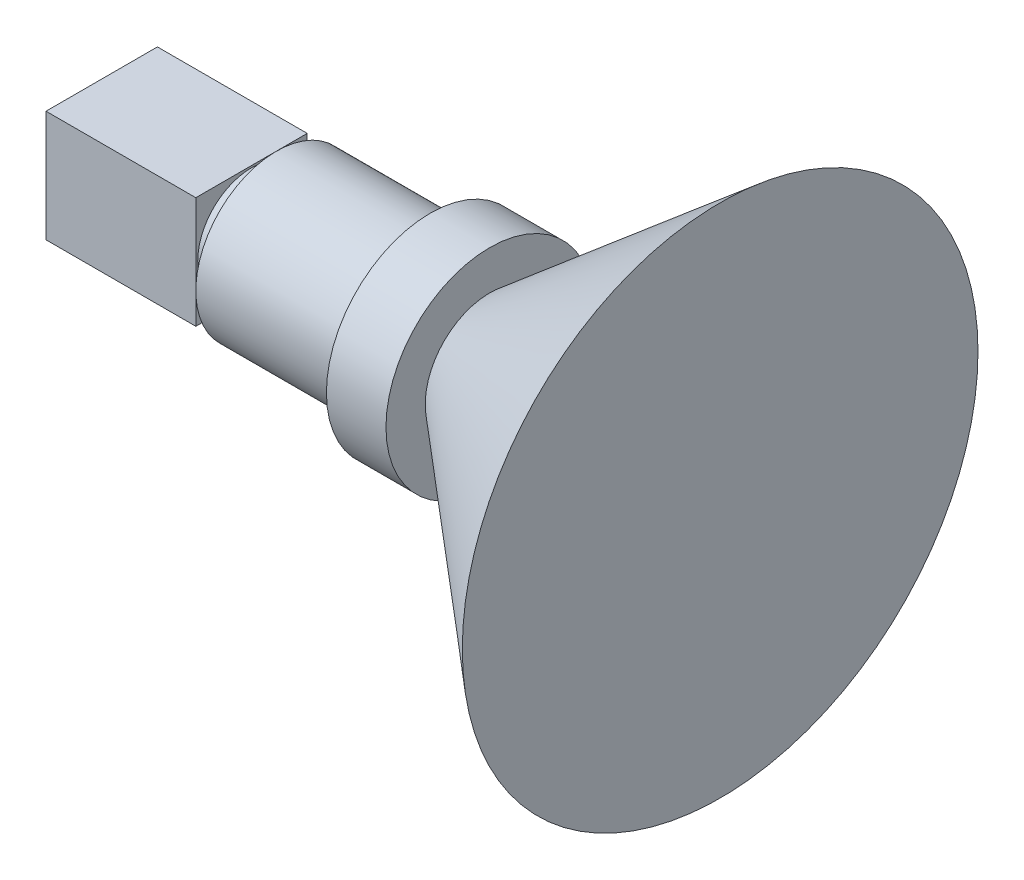
ISO-10303-21;
HEADER;
FILE_DESCRIPTION(('STEP AP214'),'2;1');
FILE_NAME('part.step','',(''),(''),'','','');
FILE_SCHEMA(('AUTOMOTIVE_DESIGN { 1 0 10303 214 1 1 1 1 }'));
ENDSEC;
DATA;
#1=APPLICATION_CONTEXT('core data for automotive mechanical design processes');
#2=APPLICATION_PROTOCOL_DEFINITION('international standard','automotive_design',2000,#1);
#3=PRODUCT_CONTEXT('',#1,'mechanical');
#4=PRODUCT('Part','Part','',(#3));
#5=PRODUCT_RELATED_PRODUCT_CATEGORY('part','',(#4));
#6=PRODUCT_DEFINITION_FORMATION('','',#4);
#7=PRODUCT_DEFINITION_CONTEXT('part definition',#1,'design');
#8=PRODUCT_DEFINITION('design','',#6,#7);
#9=PRODUCT_DEFINITION_SHAPE('','',#8);
#10=(LENGTH_UNIT() NAMED_UNIT(*) SI_UNIT(.MILLI.,.METRE.));
#11=(NAMED_UNIT(*) PLANE_ANGLE_UNIT() SI_UNIT($,.RADIAN.));
#12=(NAMED_UNIT(*) SI_UNIT($,.STERADIAN.) SOLID_ANGLE_UNIT());
#13=UNCERTAINTY_MEASURE_WITH_UNIT(LENGTH_MEASURE(1.E-05),#10,'distance_accuracy_value','');
#14=(GEOMETRIC_REPRESENTATION_CONTEXT(3) GLOBAL_UNCERTAINTY_ASSIGNED_CONTEXT((#13)) GLOBAL_UNIT_ASSIGNED_CONTEXT((#10,
#11,#12)) REPRESENTATION_CONTEXT('',''));
#15=CARTESIAN_POINT('',(0.,0.,0.));
#16=DIRECTION('',(0.,0.,1.));
#17=DIRECTION('',(1.,0.,0.));
#18=AXIS2_PLACEMENT_3D('',#15,#16,#17);
#19=CARTESIAN_POINT('',(19.5,14.5,14.5));
#20=DIRECTION('',(-1.,0.,0.));
#21=DIRECTION('',(0.,0.,1.));
#22=AXIS2_PLACEMENT_3D('',#19,#20,#21);
#23=PLANE('',#22);
#24=CARTESIAN_POINT('',(19.5,0.,0.));
#25=DIRECTION('',(1.,0.,0.));
#26=DIRECTION('',(0.,0.,-1.));
#27=AXIS2_PLACEMENT_3D('',#24,#25,#26);
#28=CIRCLE('',#27,14.);
#29=CARTESIAN_POINT('',(19.5,0.,14.));
#30=VERTEX_POINT('',#29);
#31=EDGE_CURVE('E11',#30,#30,#28,.T.);
#32=ORIENTED_EDGE('',*,*,#31,.F.);
#33=EDGE_LOOP('',(#32));
#34=FACE_BOUND('',#33,.T.);
#35=DIRECTION('',(0.,0.,-1.));
#36=VECTOR('',#35,1.);
#37=CARTESIAN_POINT('',(19.5,-14.5,14.5));
#38=LINE('',#37,#36);
#39=CARTESIAN_POINT('',(19.5,-14.5,14.5));
#40=VERTEX_POINT('',#39);
#41=CARTESIAN_POINT('',(19.5,-14.5,-14.5));
#42=VERTEX_POINT('',#41);
#43=EDGE_CURVE('E158',#40,#42,#38,.T.);
#44=ORIENTED_EDGE('',*,*,#43,.T.);
#45=DIRECTION('',(0.,-1.,0.));
#46=VECTOR('',#45,1.);
#47=CARTESIAN_POINT('',(19.5,14.5,-14.5));
#48=LINE('',#47,#46);
#49=CARTESIAN_POINT('',(19.5,14.5,-14.5));
#50=VERTEX_POINT('',#49);
#51=EDGE_CURVE('E56',#50,#42,#48,.T.);
#52=ORIENTED_EDGE('',*,*,#51,.F.);
#53=DIRECTION('',(0.,0.,-1.));
#54=VECTOR('',#53,1.);
#55=CARTESIAN_POINT('',(19.5,14.5,14.5));
#56=LINE('',#55,#54);
#57=CARTESIAN_POINT('',(19.5,14.5,14.5));
#58=VERTEX_POINT('',#57);
#59=EDGE_CURVE('E160',#58,#50,#56,.T.);
#60=ORIENTED_EDGE('',*,*,#59,.F.);
#61=DIRECTION('',(0.,-1.,0.));
#62=VECTOR('',#61,1.);
#63=CARTESIAN_POINT('',(19.5,14.5,14.5));
#64=LINE('',#63,#62);
#65=EDGE_CURVE('E166',#58,#40,#64,.T.);
#66=ORIENTED_EDGE('',*,*,#65,.T.);
#67=EDGE_LOOP('',(#44,#52,#60,#66));
#68=FACE_BOUND('',#67,.T.);
#69=ADVANCED_FACE('F47',(#34,#68),#23,.F.);
#70=CARTESIAN_POINT('',(-19.5,14.5,-14.5));
#71=DIRECTION('',(0.,0.,1.));
#72=DIRECTION('',(1.,0.,0.));
#73=AXIS2_PLACEMENT_3D('',#70,#71,#72);
#74=PLANE('',#73);
#75=DIRECTION('',(-1.,0.,0.));
#76=VECTOR('',#75,1.);
#77=CARTESIAN_POINT('',(-19.5,-14.5,-14.5));
#78=LINE('',#77,#76);
#79=CARTESIAN_POINT('',(-19.5,-14.5,-14.5));
#80=VERTEX_POINT('',#79);
#81=EDGE_CURVE('E169',#42,#80,#78,.T.);
#82=ORIENTED_EDGE('',*,*,#81,.T.);
#83=DIRECTION('',(0.,-1.,0.));
#84=VECTOR('',#83,1.);
#85=CARTESIAN_POINT('',(-19.5,14.5,-14.5));
#86=LINE('',#85,#84);
#87=CARTESIAN_POINT('',(-19.5,14.5,-14.5));
#88=VERTEX_POINT('',#87);
#89=EDGE_CURVE('E176',#88,#80,#86,.T.);
#90=ORIENTED_EDGE('',*,*,#89,.F.);
#91=DIRECTION('',(-1.,0.,0.));
#92=VECTOR('',#91,1.);
#93=CARTESIAN_POINT('',(-19.5,14.5,-14.5));
#94=LINE('',#93,#92);
#95=EDGE_CURVE('E97',#50,#88,#94,.T.);
#96=ORIENTED_EDGE('',*,*,#95,.F.);
#97=ORIENTED_EDGE('',*,*,#51,.T.);
#98=EDGE_LOOP('',(#82,#90,#96,#97));
#99=FACE_BOUND('',#98,.T.);
#100=ADVANCED_FACE('F178',(#99),#74,.F.);
#101=CARTESIAN_POINT('',(-19.5,14.5,14.5));
#102=DIRECTION('',(1.,0.,0.));
#103=DIRECTION('',(0.,0.,-1.));
#104=AXIS2_PLACEMENT_3D('',#101,#102,#103);
#105=PLANE('',#104);
#106=DIRECTION('',(0.,0.,1.));
#107=VECTOR('',#106,1.);
#108=CARTESIAN_POINT('',(-19.5,-14.5,14.5));
#109=LINE('',#108,#107);
#110=CARTESIAN_POINT('',(-19.5,-14.5,14.5));
#111=VERTEX_POINT('',#110);
#112=EDGE_CURVE('E83',#80,#111,#109,.T.);
#113=ORIENTED_EDGE('',*,*,#112,.T.);
#114=DIRECTION('',(0.,-1.,0.));
#115=VECTOR('',#114,1.);
#116=CARTESIAN_POINT('',(-19.5,14.5,14.5));
#117=LINE('',#116,#115);
#118=CARTESIAN_POINT('',(-19.5,14.5,14.5));
#119=VERTEX_POINT('',#118);
#120=EDGE_CURVE('E174',#119,#111,#117,.T.);
#121=ORIENTED_EDGE('',*,*,#120,.F.);
#122=DIRECTION('',(0.,0.,1.));
#123=VECTOR('',#122,1.);
#124=CARTESIAN_POINT('',(-19.5,14.5,14.5));
#125=LINE('',#124,#123);
#126=EDGE_CURVE('E163',#88,#119,#125,.T.);
#127=ORIENTED_EDGE('',*,*,#126,.F.);
#128=ORIENTED_EDGE('',*,*,#89,.T.);
#129=EDGE_LOOP('',(#113,#121,#127,#128));
#130=FACE_BOUND('',#129,.T.);
#131=ADVANCED_FACE('F207',(#130),#105,.F.);
#132=CARTESIAN_POINT('',(-19.5,14.5,14.5));
#133=DIRECTION('',(0.,0.,-1.));
#134=DIRECTION('',(-1.,0.,0.));
#135=AXIS2_PLACEMENT_3D('',#132,#133,#134);
#136=PLANE('',#135);
#137=DIRECTION('',(1.,0.,0.));
#138=VECTOR('',#137,1.);
#139=CARTESIAN_POINT('',(-19.5,-14.5,14.5));
#140=LINE('',#139,#138);
#141=EDGE_CURVE('E89',#111,#40,#140,.T.);
#142=ORIENTED_EDGE('',*,*,#141,.T.);
#143=ORIENTED_EDGE('',*,*,#65,.F.);
#144=DIRECTION('',(1.,0.,0.));
#145=VECTOR('',#144,1.);
#146=CARTESIAN_POINT('',(-19.5,14.5,14.5));
#147=LINE('',#146,#145);
#148=EDGE_CURVE('E65',#119,#58,#147,.T.);
#149=ORIENTED_EDGE('',*,*,#148,.F.);
#150=ORIENTED_EDGE('',*,*,#120,.T.);
#151=EDGE_LOOP('',(#142,#143,#149,#150));
#152=FACE_BOUND('',#151,.T.);
#153=ADVANCED_FACE('F197',(#152),#136,.F.);
#154=CARTESIAN_POINT('',(0.,14.5,0.));
#155=DIRECTION('',(0.,-1.,0.));
#156=DIRECTION('',(0.,0.,-1.));
#157=AXIS2_PLACEMENT_3D('',#154,#155,#156);
#158=PLANE('',#157);
#159=ORIENTED_EDGE('',*,*,#59,.T.);
#160=ORIENTED_EDGE('',*,*,#95,.T.);
#161=ORIENTED_EDGE('',*,*,#126,.T.);
#162=ORIENTED_EDGE('',*,*,#148,.T.);
#163=EDGE_LOOP('',(#159,#160,#161,#162));
#164=FACE_BOUND('',#163,.T.);
#165=ADVANCED_FACE('F186',(#164),#158,.F.);
#166=CARTESIAN_POINT('',(0.,-14.5,0.));
#167=DIRECTION('',(0.,-1.,0.));
#168=DIRECTION('',(0.,0.,-1.));
#169=AXIS2_PLACEMENT_3D('',#166,#167,#168);
#170=PLANE('',#169);
#171=CARTESIAN_POINT('',(16.5,-14.5,-11.5));
#172=DIRECTION('',(0.,-1.,0.));
#173=DIRECTION('',(0.,0.,-1.));
#174=AXIS2_PLACEMENT_3D('',#171,#172,#173);
#175=CIRCLE('',#174,1.24999999999999);
#176=CARTESIAN_POINT('',(16.5,-14.5,-12.75));
#177=VERTEX_POINT('',#176);
#178=EDGE_CURVE('E121',#177,#177,#175,.T.);
#179=ORIENTED_EDGE('',*,*,#178,.F.);
#180=EDGE_LOOP('',(#179));
#181=FACE_BOUND('',#180,.T.);
#182=CARTESIAN_POINT('',(-16.5,-14.5,-11.5));
#183=DIRECTION('',(0.,-1.,0.));
#184=DIRECTION('',(0.,0.,-1.));
#185=AXIS2_PLACEMENT_3D('',#182,#183,#184);
#186=CIRCLE('',#185,1.24999999999999);
#187=CARTESIAN_POINT('',(-16.5,-14.5,-12.75));
#188=VERTEX_POINT('',#187);
#189=EDGE_CURVE('E120',#188,#188,#186,.T.);
#190=ORIENTED_EDGE('',*,*,#189,.F.);
#191=EDGE_LOOP('',(#190));
#192=FACE_BOUND('',#191,.T.);
#193=CARTESIAN_POINT('',(-16.5,-14.5,11.5));
#194=DIRECTION('',(0.,-1.,0.));
#195=DIRECTION('',(0.,0.,-1.));
#196=AXIS2_PLACEMENT_3D('',#193,#194,#195);
#197=CIRCLE('',#196,1.24999999999999);
#198=CARTESIAN_POINT('',(-16.5,-14.5,10.25));
#199=VERTEX_POINT('',#198);
#200=EDGE_CURVE('E132',#199,#199,#197,.T.);
#201=ORIENTED_EDGE('',*,*,#200,.F.);
#202=EDGE_LOOP('',(#201));
#203=FACE_BOUND('',#202,.T.);
#204=CARTESIAN_POINT('',(16.5,-14.5,11.5));
#205=DIRECTION('',(0.,-1.,0.));
#206=DIRECTION('',(0.,0.,-1.));
#207=AXIS2_PLACEMENT_3D('',#204,#205,#206);
#208=CIRCLE('',#207,1.24999999999999);
#209=CARTESIAN_POINT('',(16.5,-14.5,10.25));
#210=VERTEX_POINT('',#209);
#211=EDGE_CURVE('E138',#210,#210,#208,.T.);
#212=ORIENTED_EDGE('',*,*,#211,.F.);
#213=EDGE_LOOP('',(#212));
#214=FACE_BOUND('',#213,.T.);
#215=ORIENTED_EDGE('',*,*,#43,.F.);
#216=ORIENTED_EDGE('',*,*,#141,.F.);
#217=ORIENTED_EDGE('',*,*,#112,.F.);
#218=ORIENTED_EDGE('',*,*,#81,.F.);
#219=EDGE_LOOP('',(#215,#216,#217,#218));
#220=FACE_BOUND('',#219,.T.);
#221=ADVANCED_FACE('F183',(#181,#192,#203,#214,#220),#170,.T.);
#222=CARTESIAN_POINT('',(26.,0.,0.));
#223=DIRECTION('',(-1.,0.,0.));
#224=DIRECTION('',(0.,0.,1.));
#225=AXIS2_PLACEMENT_3D('',#222,#223,#224);
#226=CYLINDRICAL_SURFACE('',#225,14.);
#227=CARTESIAN_POINT('',(26.,0.,0.));
#228=DIRECTION('',(1.,0.,0.));
#229=DIRECTION('',(0.,0.,-1.));
#230=AXIS2_PLACEMENT_3D('',#227,#228,#229);
#231=CIRCLE('',#230,14.);
#232=CARTESIAN_POINT('',(26.,0.,14.));
#233=VERTEX_POINT('',#232);
#234=EDGE_CURVE('E154',#233,#233,#231,.T.);
#235=CARTESIAN_POINT('',(26.,0.,14.));
#236=CARTESIAN_POINT('',(25.9322916666667,0.,14.));
#237=CARTESIAN_POINT('',(25.8645833333333,0.,14.));
#238=CARTESIAN_POINT('',(25.7291666666667,0.,14.));
#239=CARTESIAN_POINT('',(25.6614583333333,0.,14.));
#240=CARTESIAN_POINT('',(25.5260416666667,0.,14.));
#241=CARTESIAN_POINT('',(25.4583333333333,0.,14.));
#242=CARTESIAN_POINT('',(25.3229166666667,0.,14.));
#243=CARTESIAN_POINT('',(25.2552083333333,0.,14.));
#244=CARTESIAN_POINT('',(25.1197916666667,0.,14.));
#245=CARTESIAN_POINT('',(25.0520833333333,0.,14.));
#246=CARTESIAN_POINT('',(24.9166666666667,0.,14.));
#247=CARTESIAN_POINT('',(24.8489583333333,0.,14.));
#248=CARTESIAN_POINT('',(24.7135416666667,0.,14.));
#249=CARTESIAN_POINT('',(24.6458333333333,0.,14.));
#250=CARTESIAN_POINT('',(24.5104166666667,0.,14.));
#251=CARTESIAN_POINT('',(24.4427083333333,0.,14.));
#252=CARTESIAN_POINT('',(24.3072916666667,0.,14.));
#253=CARTESIAN_POINT('',(24.2395833333333,0.,14.));
#254=CARTESIAN_POINT('',(24.1041666666667,0.,14.));
#255=CARTESIAN_POINT('',(24.0364583333333,0.,14.));
#256=CARTESIAN_POINT('',(23.9010416666667,0.,14.));
#257=CARTESIAN_POINT('',(23.8333333333333,0.,14.));
#258=CARTESIAN_POINT('',(23.6979166666667,0.,14.));
#259=CARTESIAN_POINT('',(23.6302083333333,0.,14.));
#260=CARTESIAN_POINT('',(23.4947916666667,0.,14.));
#261=CARTESIAN_POINT('',(23.4270833333333,0.,14.));
#262=CARTESIAN_POINT('',(23.2916666666667,0.,14.));
#263=CARTESIAN_POINT('',(23.2239583333333,0.,14.));
#264=CARTESIAN_POINT('',(23.0885416666667,0.,14.));
#265=CARTESIAN_POINT('',(23.0208333333333,0.,14.));
#266=CARTESIAN_POINT('',(22.8854166666667,0.,14.));
#267=CARTESIAN_POINT('',(22.8177083333333,0.,14.));
#268=CARTESIAN_POINT('',(22.6822916666667,0.,14.));
#269=CARTESIAN_POINT('',(22.6145833333333,0.,14.));
#270=CARTESIAN_POINT('',(22.4791666666667,0.,14.));
#271=CARTESIAN_POINT('',(22.4114583333333,0.,14.));
#272=CARTESIAN_POINT('',(22.2760416666667,0.,14.));
#273=CARTESIAN_POINT('',(22.2083333333333,0.,14.));
#274=CARTESIAN_POINT('',(22.0729166666667,0.,14.));
#275=CARTESIAN_POINT('',(22.0052083333333,0.,14.));
#276=CARTESIAN_POINT('',(21.8697916666667,0.,14.));
#277=CARTESIAN_POINT('',(21.8020833333333,0.,14.));
#278=CARTESIAN_POINT('',(21.6666666666667,0.,14.));
#279=CARTESIAN_POINT('',(21.5989583333333,0.,14.));
#280=CARTESIAN_POINT('',(21.4635416666667,0.,14.));
#281=CARTESIAN_POINT('',(21.3958333333333,0.,14.));
#282=CARTESIAN_POINT('',(21.2604166666667,0.,14.));
#283=CARTESIAN_POINT('',(21.1927083333333,0.,14.));
#284=CARTESIAN_POINT('',(21.0572916666667,0.,14.));
#285=CARTESIAN_POINT('',(20.9895833333333,0.,14.));
#286=CARTESIAN_POINT('',(20.8541666666667,0.,14.));
#287=CARTESIAN_POINT('',(20.7864583333333,0.,14.));
#288=CARTESIAN_POINT('',(20.6510416666667,0.,14.));
#289=CARTESIAN_POINT('',(20.5833333333333,0.,14.));
#290=CARTESIAN_POINT('',(20.4479166666667,0.,14.));
#291=CARTESIAN_POINT('',(20.3802083333333,0.,14.));
#292=CARTESIAN_POINT('',(20.2447916666667,0.,14.));
#293=CARTESIAN_POINT('',(20.1770833333333,0.,14.));
#294=CARTESIAN_POINT('',(20.0416666666667,0.,14.));
#295=CARTESIAN_POINT('',(19.9739583333333,0.,14.));
#296=CARTESIAN_POINT('',(19.8385416666667,0.,14.));
#297=CARTESIAN_POINT('',(19.7708333333333,0.,14.));
#298=CARTESIAN_POINT('',(19.6354166666667,0.,14.));
#299=CARTESIAN_POINT('',(19.5677083333333,0.,14.));
#300=CARTESIAN_POINT('',(19.5,0.,14.));
#301=B_SPLINE_CURVE_WITH_KNOTS('',3,(#235,#236,#237,#238,#239,#240,#241,#242,#243,#244,#245,
#246,#247,#248,#249,#250,#251,#252,#253,#254,#255,#256,#257,#258,#259,#260,#261,#262,#263,#264,
#265,#266,#267,#268,#269,#270,#271,#272,#273,#274,#275,#276,#277,#278,#279,#280,#281,#282,#283,
#284,#285,#286,#287,#288,#289,#290,#291,#292,#293,#294,#295,#296,#297,#298,#299,#300),
.UNSPECIFIED.,.F.,.F.,(4,2,2,2,2,2,2,2,2,2,2,2,2,2,2,2,2,2,2,2,2,2,2,2,2,2,2,2,2,2,2,2,4),(0.,
0.203125000000002,0.40625,0.609375000000002,0.812500000000001,1.015625,1.21875,1.421875,1.625,
1.828125,2.03125,2.234375,2.4375,2.640625,2.84375,3.046875,3.25,3.453125,3.65625,3.859375,
4.0625,4.265625,4.46875,4.671875,4.875,5.078125,5.28125,5.484375,5.6875,5.890625,6.09375,
6.296875,6.5),.UNSPECIFIED.);
#302=EDGE_CURVE('BSEAM185',#233,#30,#301,.T.);
#303=ORIENTED_EDGE('',*,*,#234,.F.);
#304=ORIENTED_EDGE('',*,*,#31,.T.);
#305=ORIENTED_EDGE('',*,*,#302,.T.);
#306=ORIENTED_EDGE('',*,*,#302,.F.);
#307=EDGE_LOOP('',(#303,#305,#304,#306));
#308=FACE_BOUND('',#307,.T.);
#309=ADVANCED_FACE('F185',(#308),#226,.T.);
#310=CARTESIAN_POINT('',(66.,0.,0.));
#311=DIRECTION('',(-1.,0.,0.));
#312=DIRECTION('',(0.,0.,1.));
#313=AXIS2_PLACEMENT_3D('',#310,#311,#312);
#314=CYLINDRICAL_SURFACE('',#313,21.);
#315=CARTESIAN_POINT('',(66.,0.,0.));
#316=DIRECTION('',(1.,0.,0.));
#317=DIRECTION('',(0.,0.,-1.));
#318=AXIS2_PLACEMENT_3D('',#315,#316,#317);
#319=CIRCLE('',#318,21.);
#320=CARTESIAN_POINT('',(66.,0.,-21.));
#321=VERTEX_POINT('',#320);
#322=EDGE_CURVE('E151',#321,#321,#319,.T.);
#323=ORIENTED_EDGE('',*,*,#322,.F.);
#324=EDGE_LOOP('',(#323));
#325=FACE_BOUND('',#324,.T.);
#326=CARTESIAN_POINT('',(26.,0.,0.));
#327=DIRECTION('',(1.,0.,0.));
#328=DIRECTION('',(0.,0.,-1.));
#329=AXIS2_PLACEMENT_3D('',#326,#327,#328);
#330=CIRCLE('',#329,21.);
#331=CARTESIAN_POINT('',(26.,0.,-21.));
#332=VERTEX_POINT('',#331);
#333=EDGE_CURVE('E148',#332,#332,#330,.T.);
#334=ORIENTED_EDGE('',*,*,#333,.T.);
#335=EDGE_LOOP('',(#334));
#336=FACE_BOUND('',#335,.T.);
#337=ADVANCED_FACE('F193',(#325,#336),#314,.T.);
#338=CARTESIAN_POINT('',(26.,0.,0.));
#339=DIRECTION('',(1.,0.,0.));
#340=DIRECTION('',(0.,0.,-1.));
#341=AXIS2_PLACEMENT_3D('',#338,#339,#340);
#342=PLANE('',#341);
#343=ORIENTED_EDGE('',*,*,#234,.T.);
#344=EDGE_LOOP('',(#343));
#345=FACE_BOUND('',#344,.T.);
#346=ORIENTED_EDGE('',*,*,#333,.F.);
#347=EDGE_LOOP('',(#346));
#348=FACE_BOUND('',#347,.T.);
#349=ADVANCED_FACE('F250',(#345,#348),#342,.F.);
#350=CARTESIAN_POINT('',(81.5,0.,0.));
#351=DIRECTION('',(-1.,0.,0.));
#352=DIRECTION('',(0.,0.,1.));
#353=AXIS2_PLACEMENT_3D('',#350,#351,#352);
#354=CYLINDRICAL_SURFACE('',#353,27.);
#355=CARTESIAN_POINT('',(81.5,0.,0.));
#356=DIRECTION('',(1.,0.,0.));
#357=DIRECTION('',(0.,0.,-1.));
#358=AXIS2_PLACEMENT_3D('',#355,#356,#357);
#359=CIRCLE('',#358,27.);
#360=CARTESIAN_POINT('',(81.5,0.,-27.));
#361=VERTEX_POINT('',#360);
#362=EDGE_CURVE('E145',#361,#361,#359,.T.);
#363=ORIENTED_EDGE('',*,*,#362,.F.);
#364=EDGE_LOOP('',(#363));
#365=FACE_BOUND('',#364,.T.);
#366=CARTESIAN_POINT('',(66.,0.,0.));
#367=DIRECTION('',(1.,0.,0.));
#368=DIRECTION('',(0.,0.,-1.));
#369=AXIS2_PLACEMENT_3D('',#366,#367,#368);
#370=CIRCLE('',#369,27.);
#371=CARTESIAN_POINT('',(66.,0.,-27.));
#372=VERTEX_POINT('',#371);
#373=EDGE_CURVE('E144',#372,#372,#370,.T.);
#374=ORIENTED_EDGE('',*,*,#373,.T.);
#375=EDGE_LOOP('',(#374));
#376=FACE_BOUND('',#375,.T.);
#377=ADVANCED_FACE('F260',(#365,#376),#354,.T.);
#378=CARTESIAN_POINT('',(81.5,0.,0.));
#379=DIRECTION('',(1.,0.,0.));
#380=DIRECTION('',(0.,0.,-1.));
#381=AXIS2_PLACEMENT_3D('',#378,#379,#380);
#382=PLANE('',#381);
#383=CARTESIAN_POINT('',(81.5,0.,0.));
#384=DIRECTION('',(1.,0.,0.));
#385=DIRECTION('',(0.,0.,-1.));
#386=AXIS2_PLACEMENT_3D('',#383,#384,#385);
#387=CIRCLE('',#386,16.7819926235456);
#388=CARTESIAN_POINT('',(81.5,0.,-16.7819926235456));
#389=VERTEX_POINT('',#388);
#390=EDGE_CURVE('E50',#389,#389,#387,.F.);
#391=ORIENTED_EDGE('',*,*,#390,.T.);
#392=EDGE_LOOP('',(#391));
#393=FACE_BOUND('',#392,.T.);
#394=ORIENTED_EDGE('',*,*,#362,.T.);
#395=EDGE_LOOP('',(#394));
#396=FACE_BOUND('',#395,.T.);
#397=ADVANCED_FACE('F270',(#393,#396),#382,.T.);
#398=CARTESIAN_POINT('',(66.,0.,0.));
#399=DIRECTION('',(1.,0.,0.));
#400=DIRECTION('',(0.,0.,-1.));
#401=AXIS2_PLACEMENT_3D('',#398,#399,#400);
#402=PLANE('',#401);
#403=ORIENTED_EDGE('',*,*,#322,.T.);
#404=EDGE_LOOP('',(#403));
#405=FACE_BOUND('',#404,.T.);
#406=ORIENTED_EDGE('',*,*,#373,.F.);
#407=EDGE_LOOP('',(#406));
#408=FACE_BOUND('',#407,.T.);
#409=ADVANCED_FACE('F280',(#405,#408),#402,.F.);
#410=CARTESIAN_POINT('',(16.5,-9.5,11.5));
#411=DIRECTION('',(0.,-1.,0.));
#412=DIRECTION('',(0.,0.,-1.));
#413=AXIS2_PLACEMENT_3D('',#410,#411,#412);
#414=CONICAL_SURFACE('',#413,1.25,1.02974425867665);
#415=CARTESIAN_POINT('',(16.5,-8.74892422621555,11.5));
#416=VERTEX_POINT('',#415);
#417=VERTEX_LOOP('',#416);
#418=FACE_BOUND('',#417,.T.);
#419=CARTESIAN_POINT('',(16.5,-9.5,11.5));
#420=DIRECTION('',(0.,-1.,0.));
#421=DIRECTION('',(0.,0.,-1.));
#422=AXIS2_PLACEMENT_3D('',#419,#420,#421);
#423=CIRCLE('',#422,1.25);
#424=CARTESIAN_POINT('',(16.5,-9.5,10.25));
#425=VERTEX_POINT('',#424);
#426=EDGE_CURVE('E141',#425,#425,#423,.T.);
#427=ORIENTED_EDGE('',*,*,#426,.T.);
#428=EDGE_LOOP('',(#427));
#429=FACE_BOUND('',#428,.T.);
#430=ADVANCED_FACE('F291',(#418,#429),#414,.F.);
#431=CARTESIAN_POINT('',(16.5,-14.5,11.5));
#432=DIRECTION('',(0.,-1.,0.));
#433=DIRECTION('',(0.,0.,-1.));
#434=AXIS2_PLACEMENT_3D('',#431,#432,#433);
#435=CYLINDRICAL_SURFACE('',#434,1.24999999999999);
#436=ORIENTED_EDGE('',*,*,#426,.F.);
#437=EDGE_LOOP('',(#436));
#438=FACE_BOUND('',#437,.T.);
#439=ORIENTED_EDGE('',*,*,#211,.T.);
#440=EDGE_LOOP('',(#439));
#441=FACE_BOUND('',#440,.T.);
#442=ADVANCED_FACE('F300',(#438,#441),#435,.F.);
#443=CARTESIAN_POINT('',(-16.5,-9.5,11.5));
#444=DIRECTION('',(0.,-1.,0.));
#445=DIRECTION('',(0.,0.,-1.));
#446=AXIS2_PLACEMENT_3D('',#443,#444,#445);
#447=CONICAL_SURFACE('',#446,1.25,1.02974425867665);
#448=CARTESIAN_POINT('',(-16.5,-8.74892422621555,11.5));
#449=VERTEX_POINT('',#448);
#450=VERTEX_LOOP('',#449);
#451=FACE_BOUND('',#450,.T.);
#452=CARTESIAN_POINT('',(-16.5,-9.5,11.5));
#453=DIRECTION('',(0.,-1.,0.));
#454=DIRECTION('',(0.,0.,-1.));
#455=AXIS2_PLACEMENT_3D('',#452,#453,#454);
#456=CIRCLE('',#455,1.25);
#457=CARTESIAN_POINT('',(-16.5,-9.5,10.25));
#458=VERTEX_POINT('',#457);
#459=EDGE_CURVE('E135',#458,#458,#456,.T.);
#460=ORIENTED_EDGE('',*,*,#459,.T.);
#461=EDGE_LOOP('',(#460));
#462=FACE_BOUND('',#461,.T.);
#463=ADVANCED_FACE('F310',(#451,#462),#447,.F.);
#464=CARTESIAN_POINT('',(-16.5,-14.5,11.5));
#465=DIRECTION('',(0.,-1.,0.));
#466=DIRECTION('',(0.,0.,-1.));
#467=AXIS2_PLACEMENT_3D('',#464,#465,#466);
#468=CYLINDRICAL_SURFACE('',#467,1.24999999999999);
#469=ORIENTED_EDGE('',*,*,#459,.F.);
#470=EDGE_LOOP('',(#469));
#471=FACE_BOUND('',#470,.T.);
#472=ORIENTED_EDGE('',*,*,#200,.T.);
#473=EDGE_LOOP('',(#472));
#474=FACE_BOUND('',#473,.T.);
#475=ADVANCED_FACE('F321',(#471,#474),#468,.F.);
#476=CARTESIAN_POINT('',(-16.5,-9.5,-11.5));
#477=DIRECTION('',(0.,-1.,0.));
#478=DIRECTION('',(0.,0.,-1.));
#479=AXIS2_PLACEMENT_3D('',#476,#477,#478);
#480=CONICAL_SURFACE('',#479,1.25,1.02974425867665);
#481=CARTESIAN_POINT('',(-16.5,-8.74892422621555,-11.5));
#482=VERTEX_POINT('',#481);
#483=VERTEX_LOOP('',#482);
#484=FACE_BOUND('',#483,.T.);
#485=CARTESIAN_POINT('',(-16.5,-9.5,-11.5));
#486=DIRECTION('',(0.,-1.,0.));
#487=DIRECTION('',(0.,0.,-1.));
#488=AXIS2_PLACEMENT_3D('',#485,#486,#487);
#489=CIRCLE('',#488,1.25);
#490=CARTESIAN_POINT('',(-16.5,-9.5,-12.75));
#491=VERTEX_POINT('',#490);
#492=EDGE_CURVE('E124',#491,#491,#489,.T.);
#493=ORIENTED_EDGE('',*,*,#492,.T.);
#494=EDGE_LOOP('',(#493));
#495=FACE_BOUND('',#494,.T.);
#496=ADVANCED_FACE('F332',(#484,#495),#480,.F.);
#497=CARTESIAN_POINT('',(-16.5,-14.5,-11.5));
#498=DIRECTION('',(0.,-1.,0.));
#499=DIRECTION('',(0.,0.,-1.));
#500=AXIS2_PLACEMENT_3D('',#497,#498,#499);
#501=CYLINDRICAL_SURFACE('',#500,1.24999999999999);
#502=ORIENTED_EDGE('',*,*,#492,.F.);
#503=EDGE_LOOP('',(#502));
#504=FACE_BOUND('',#503,.T.);
#505=ORIENTED_EDGE('',*,*,#189,.T.);
#506=EDGE_LOOP('',(#505));
#507=FACE_BOUND('',#506,.T.);
#508=ADVANCED_FACE('F114',(#504,#507),#501,.F.);
#509=CARTESIAN_POINT('',(16.5,-9.5,-11.5));
#510=DIRECTION('',(0.,-1.,0.));
#511=DIRECTION('',(0.,0.,-1.));
#512=AXIS2_PLACEMENT_3D('',#509,#510,#511);
#513=CONICAL_SURFACE('',#512,1.25,1.02974425867665);
#514=CARTESIAN_POINT('',(16.5,-8.74892422621555,-11.5));
#515=VERTEX_POINT('',#514);
#516=VERTEX_LOOP('',#515);
#517=FACE_BOUND('',#516,.T.);
#518=CARTESIAN_POINT('',(16.5,-9.5,-11.5));
#519=DIRECTION('',(0.,-1.,0.));
#520=DIRECTION('',(0.,0.,-1.));
#521=AXIS2_PLACEMENT_3D('',#518,#519,#520);
#522=CIRCLE('',#521,1.25);
#523=CARTESIAN_POINT('',(16.5,-9.5,-12.75));
#524=VERTEX_POINT('',#523);
#525=EDGE_CURVE('E118',#524,#524,#522,.T.);
#526=ORIENTED_EDGE('',*,*,#525,.T.);
#527=EDGE_LOOP('',(#526));
#528=FACE_BOUND('',#527,.T.);
#529=ADVANCED_FACE('F110',(#517,#528),#513,.F.);
#530=CARTESIAN_POINT('',(16.5,-14.5,-11.5));
#531=DIRECTION('',(0.,-1.,0.));
#532=DIRECTION('',(0.,0.,-1.));
#533=AXIS2_PLACEMENT_3D('',#530,#531,#532);
#534=CYLINDRICAL_SURFACE('',#533,1.24999999999999);
#535=ORIENTED_EDGE('',*,*,#525,.F.);
#536=EDGE_LOOP('',(#535));
#537=FACE_BOUND('',#536,.T.);
#538=ORIENTED_EDGE('',*,*,#178,.T.);
#539=EDGE_LOOP('',(#538));
#540=FACE_BOUND('',#539,.T.);
#541=ADVANCED_FACE('F113',(#537,#540),#534,.F.);
#542=CARTESIAN_POINT('',(141.5,0.,0.));
#543=DIRECTION('',(-1.,0.,0.));
#544=DIRECTION('',(0.,0.,1.));
#545=AXIS2_PLACEMENT_3D('',#542,#543,#544);
#546=PLANE('',#545);
#547=CARTESIAN_POINT('',(141.5,0.,0.));
#548=DIRECTION('',(-1.,0.,0.));
#549=DIRECTION('',(0.,0.,1.));
#550=AXIS2_PLACEMENT_3D('',#547,#548,#549);
#551=CIRCLE('',#550,67.1279704941822);
#552=CARTESIAN_POINT('',(141.5,0.,-67.1279704941822));
#553=VERTEX_POINT('',#552);
#554=EDGE_CURVE('E404',#553,#553,#551,.T.);
#555=ORIENTED_EDGE('',*,*,#554,.F.);
#556=EDGE_LOOP('',(#555));
#557=FACE_BOUND('',#556,.T.);
#558=ADVANCED_FACE('F369',(#557),#546,.F.);
#559=CARTESIAN_POINT('',(141.5,0.,0.));
#560=DIRECTION('',(1.,0.,0.));
#561=DIRECTION('',(0.,0.,-1.));
#562=AXIS2_PLACEMENT_3D('',#559,#560,#561);
#563=CONICAL_SURFACE('',#562,67.1279704941822,0.69813170079773);
#564=CARTESIAN_POINT('',(81.5,0.,-16.7819926235456));
#565=CARTESIAN_POINT('',(82.125,0.,-17.3064298930314));
#566=CARTESIAN_POINT('',(82.75,0.,-17.8308671625172));
#567=CARTESIAN_POINT('',(84.,0.,-18.8797417014888));
#568=CARTESIAN_POINT('',(84.625,0.,-19.4041789709746));
#569=CARTESIAN_POINT('',(85.875,0.,-20.4530535099462));
#570=CARTESIAN_POINT('',(86.5,0.,-20.977490779432));
#571=CARTESIAN_POINT('',(87.75,0.,-22.0263653184036));
#572=CARTESIAN_POINT('',(88.375,0.,-22.5508025878894));
#573=CARTESIAN_POINT('',(89.625,0.,-23.599677126861));
#574=CARTESIAN_POINT('',(90.25,0.,-24.1241143963467));
#575=CARTESIAN_POINT('',(91.5,0.,-25.1729889353183));
#576=CARTESIAN_POINT('',(92.125,0.,-25.6974262048041));
#577=CARTESIAN_POINT('',(93.375,0.,-26.7463007437757));
#578=CARTESIAN_POINT('',(94.,0.,-27.2707380132615));
#579=CARTESIAN_POINT('',(95.25,0.,-28.3196125522331));
#580=CARTESIAN_POINT('',(95.875,0.,-28.8440498217189));
#581=CARTESIAN_POINT('',(97.125,0.,-29.8929243606905));
#582=CARTESIAN_POINT('',(97.75,0.,-30.4173616301763));
#583=CARTESIAN_POINT('',(99.,0.,-31.4662361691479));
#584=CARTESIAN_POINT('',(99.625,0.,-31.9906734386337));
#585=CARTESIAN_POINT('',(100.875,0.,-33.0395479776053));
#586=CARTESIAN_POINT('',(101.5,0.,-33.5639852470911));
#587=CARTESIAN_POINT('',(102.75,0.,-34.6128597860627));
#588=CARTESIAN_POINT('',(103.375,0.,-35.1372970555485));
#589=CARTESIAN_POINT('',(104.625,0.,-36.1861715945201));
#590=CARTESIAN_POINT('',(105.25,0.,-36.7106088640059));
#591=CARTESIAN_POINT('',(106.5,0.,-37.7594834029775));
#592=CARTESIAN_POINT('',(107.125,0.,-38.2839206724633));
#593=CARTESIAN_POINT('',(108.375,0.,-39.3327952114349));
#594=CARTESIAN_POINT('',(109.,0.,-39.8572324809207));
#595=CARTESIAN_POINT('',(110.25,0.,-40.9061070198923));
#596=CARTESIAN_POINT('',(110.875,0.,-41.4305442893781));
#597=CARTESIAN_POINT('',(112.125,0.,-42.4794188283497));
#598=CARTESIAN_POINT('',(112.75,0.,-43.0038560978355));
#599=CARTESIAN_POINT('',(114.,0.,-44.0527306368071));
#600=CARTESIAN_POINT('',(114.625,0.,-44.5771679062929));
#601=CARTESIAN_POINT('',(115.875,0.,-45.6260424452645));
#602=CARTESIAN_POINT('',(116.5,0.,-46.1504797147503));
#603=CARTESIAN_POINT('',(117.75,0.,-47.1993542537219));
#604=CARTESIAN_POINT('',(118.375,0.,-47.7237915232077));
#605=CARTESIAN_POINT('',(119.625,0.,-48.7726660621793));
#606=CARTESIAN_POINT('',(120.25,0.,-49.2971033316651));
#607=CARTESIAN_POINT('',(121.5,0.,-50.3459778706367));
#608=CARTESIAN_POINT('',(122.125,0.,-50.8704151401225));
#609=CARTESIAN_POINT('',(123.375,0.,-51.9192896790941));
#610=CARTESIAN_POINT('',(124.,0.,-52.4437269485799));
#611=CARTESIAN_POINT('',(125.25,0.,-53.4926014875515));
#612=CARTESIAN_POINT('',(125.875,0.,-54.0170387570373));
#613=CARTESIAN_POINT('',(127.125,0.,-55.0659132960089));
#614=CARTESIAN_POINT('',(127.75,0.,-55.5903505654947));
#615=CARTESIAN_POINT('',(129.,0.,-56.6392251044663));
#616=CARTESIAN_POINT('',(129.625,0.,-57.1636623739521));
#617=CARTESIAN_POINT('',(130.875,0.,-58.2125369129237));
#618=CARTESIAN_POINT('',(131.5,0.,-58.7369741824095));
#619=CARTESIAN_POINT('',(132.75,0.,-59.7858487213811));
#620=CARTESIAN_POINT('',(133.375,0.,-60.3102859908668));
#621=CARTESIAN_POINT('',(134.625,0.,-61.3591605298384));
#622=CARTESIAN_POINT('',(135.25,0.,-61.8835977993242));
#623=CARTESIAN_POINT('',(136.5,0.,-62.9324723382958));
#624=CARTESIAN_POINT('',(137.125,0.,-63.4569096077816));
#625=CARTESIAN_POINT('',(138.375,0.,-64.5057841467532));
#626=CARTESIAN_POINT('',(139.,0.,-65.030221416239));
#627=CARTESIAN_POINT('',(140.25,0.,-66.0790959552106));
#628=CARTESIAN_POINT('',(140.875,0.,-66.6035332246964));
#629=CARTESIAN_POINT('',(141.5,0.,-67.1279704941822));
#630=B_SPLINE_CURVE_WITH_KNOTS('',3,(#564,#565,#566,#567,#568,#569,#570,#571,#572,#573,#574,
#575,#576,#577,#578,#579,#580,#581,#582,#583,#584,#585,#586,#587,#588,#589,#590,#591,#592,#593,
#594,#595,#596,#597,#598,#599,#600,#601,#602,#603,#604,#605,#606,#607,#608,#609,#610,#611,#612,
#613,#614,#615,#616,#617,#618,#619,#620,#621,#622,#623,#624,#625,#626,#627,#628,#629),
.UNSPECIFIED.,.F.,.F.,(4,2,2,2,2,2,2,2,2,2,2,2,2,2,2,2,2,2,2,2,2,2,2,2,2,2,2,2,2,2,2,2,4),(0.,
2.44763866749802,4.89527733499604,7.34291600249406,9.79055466999209,12.2381933374901,
14.6858320049881,17.1334706724861,19.5811093399842,22.0287480074822,24.4763866749802,
26.9240253424782,29.3716640099762,31.8193026774743,34.2669413449723,36.7145800124703,
39.1622186799683,41.6098573474663,44.0574960149644,46.5051346824624,48.9527733499604,
51.4004120174584,53.8480506849565,56.2956893524545,58.7433280199525,61.1909666874505,
63.6386053549485,66.0862440224466,68.5338826899446,70.9815213574426,73.4291600249406,
75.8767986924386,78.3244373599367),.UNSPECIFIED.);
#631=EDGE_CURVE('BSEAM379',#389,#553,#630,.T.);
#632=ORIENTED_EDGE('',*,*,#390,.F.);
#633=ORIENTED_EDGE('',*,*,#554,.T.);
#634=ORIENTED_EDGE('',*,*,#631,.T.);
#635=ORIENTED_EDGE('',*,*,#631,.F.);
#636=EDGE_LOOP('',(#632,#634,#633,#635));
#637=FACE_BOUND('',#636,.T.);
#638=ADVANCED_FACE('F379',(#637),#563,.T.);
#639=CLOSED_SHELL('',(#69,#100,#131,#153,#165,#221,#309,#337,#349,#377,#397,#409,#430,#442,#463,
#475,#496,#508,#529,#541,#558,#638));
#640=MANIFOLD_SOLID_BREP('B2',#639);
#641=ADVANCED_BREP_SHAPE_REPRESENTATION('',(#18,#640),#14);
#642=SHAPE_DEFINITION_REPRESENTATION(#9,#641);
ENDSEC;
END-ISO-10303-21;
